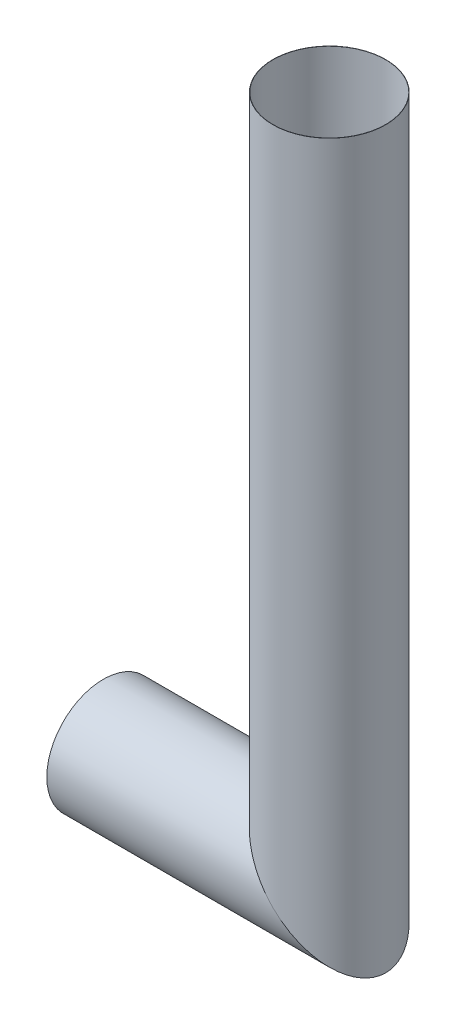
ISO-10303-21;
HEADER;
FILE_DESCRIPTION(('STEP AP214'),'2;1');
FILE_NAME('part.step','',(''),(''),'','','');
FILE_SCHEMA(('AUTOMOTIVE_DESIGN { 1 0 10303 214 1 1 1 1 }'));
ENDSEC;
DATA;
#1=APPLICATION_CONTEXT('core data for automotive mechanical design processes');
#2=APPLICATION_PROTOCOL_DEFINITION('international standard','automotive_design',2000,#1);
#3=PRODUCT_CONTEXT('',#1,'mechanical');
#4=PRODUCT('Part','Part','',(#3));
#5=PRODUCT_RELATED_PRODUCT_CATEGORY('part','',(#4));
#6=PRODUCT_DEFINITION_FORMATION('','',#4);
#7=PRODUCT_DEFINITION_CONTEXT('part definition',#1,'design');
#8=PRODUCT_DEFINITION('design','',#6,#7);
#9=PRODUCT_DEFINITION_SHAPE('','',#8);
#10=(LENGTH_UNIT() NAMED_UNIT(*) SI_UNIT(.MILLI.,.METRE.));
#11=(NAMED_UNIT(*) PLANE_ANGLE_UNIT() SI_UNIT($,.RADIAN.));
#12=(NAMED_UNIT(*) SI_UNIT($,.STERADIAN.) SOLID_ANGLE_UNIT());
#13=UNCERTAINTY_MEASURE_WITH_UNIT(LENGTH_MEASURE(1.E-05),#10,'distance_accuracy_value','');
#14=(GEOMETRIC_REPRESENTATION_CONTEXT(3) GLOBAL_UNCERTAINTY_ASSIGNED_CONTEXT((#13)) GLOBAL_UNIT_ASSIGNED_CONTEXT((#10,
#11,#12)) REPRESENTATION_CONTEXT('',''));
#15=CARTESIAN_POINT('',(0.,0.,0.));
#16=DIRECTION('',(0.,0.,1.));
#17=DIRECTION('',(1.,0.,0.));
#18=AXIS2_PLACEMENT_3D('',#15,#16,#17);
#19=CARTESIAN_POINT('',(0.,76.2,0.));
#20=DIRECTION('',(0.,1.,0.));
#21=DIRECTION('',(0.,0.,1.));
#22=AXIS2_PLACEMENT_3D('',#19,#20,#21);
#23=PLANE('',#22);
#24=CARTESIAN_POINT('',(0.,76.2,0.));
#25=DIRECTION('',(0.,1.,0.));
#26=DIRECTION('',(0.,0.,1.));
#27=AXIS2_PLACEMENT_3D('',#24,#25,#26);
#28=CIRCLE('',#27,6.3246);
#29=CARTESIAN_POINT('',(0.,76.2,6.3246));
#30=VERTEX_POINT('',#29);
#31=EDGE_CURVE('E48',#30,#30,#28,.T.);
#32=ORIENTED_EDGE('',*,*,#31,.F.);
#33=EDGE_LOOP('',(#32));
#34=FACE_BOUND('',#33,.T.);
#35=CARTESIAN_POINT('',(0.,76.2,0.));
#36=DIRECTION('',(0.,1.,0.));
#37=DIRECTION('',(0.,0.,1.));
#38=AXIS2_PLACEMENT_3D('',#35,#36,#37);
#39=CIRCLE('',#38,6.35);
#40=CARTESIAN_POINT('',(0.,76.2,6.35));
#41=VERTEX_POINT('',#40);
#42=EDGE_CURVE('E34',#41,#41,#39,.T.);
#43=ORIENTED_EDGE('',*,*,#42,.T.);
#44=EDGE_LOOP('',(#43));
#45=FACE_BOUND('',#44,.T.);
#46=ADVANCED_FACE('F31',(#34,#45),#23,.T.);
#47=CARTESIAN_POINT('',(-25.4,0.,0.));
#48=DIRECTION('',(1.,0.,0.));
#49=DIRECTION('',(0.,0.,1.));
#50=AXIS2_PLACEMENT_3D('',#47,#48,#49);
#51=PLANE('',#50);
#52=CARTESIAN_POINT('',(-25.4,0.,0.));
#53=DIRECTION('',(1.,0.,0.));
#54=DIRECTION('',(0.,1.,0.));
#55=AXIS2_PLACEMENT_3D('',#52,#53,#54);
#56=CIRCLE('',#55,6.3246);
#57=CARTESIAN_POINT('',(-25.4,6.3246,0.));
#58=VERTEX_POINT('',#57);
#59=EDGE_CURVE('E44',#58,#58,#56,.T.);
#60=ORIENTED_EDGE('',*,*,#59,.T.);
#61=EDGE_LOOP('',(#60));
#62=FACE_BOUND('',#61,.T.);
#63=CARTESIAN_POINT('',(-25.4,0.,0.));
#64=DIRECTION('',(1.,0.,0.));
#65=DIRECTION('',(0.,0.,1.));
#66=AXIS2_PLACEMENT_3D('',#63,#64,#65);
#67=CIRCLE('',#66,6.35);
#68=CARTESIAN_POINT('',(-25.4,0.,6.35));
#69=VERTEX_POINT('',#68);
#70=EDGE_CURVE('E38',#69,#69,#67,.T.);
#71=ORIENTED_EDGE('',*,*,#70,.F.);
#72=EDGE_LOOP('',(#71));
#73=FACE_BOUND('',#72,.T.);
#74=ADVANCED_FACE('F61',(#62,#73),#51,.F.);
#75=CARTESIAN_POINT('',(0.,-14.07,0.));
#76=DIRECTION('',(0.,1.,0.));
#77=DIRECTION('',(0.,0.,1.));
#78=AXIS2_PLACEMENT_3D('',#75,#76,#77);
#79=CYLINDRICAL_SURFACE('',#78,6.35);
#80=CARTESIAN_POINT('',(0.,0.,0.));
#81=DIRECTION('',(0.707106781186548,0.707106781186548,0.));
#82=DIRECTION('',(0.707106781186548,-0.707106781186548,0.));
#83=AXIS2_PLACEMENT_3D('',#80,#81,#82);
#84=ELLIPSE('',#83,8.98025612106915,6.35);
#85=CARTESIAN_POINT('',(6.35,-6.35,0.));
#86=VERTEX_POINT('',#85);
#87=EDGE_CURVE('E10',#86,#86,#84,.F.);
#88=ORIENTED_EDGE('',*,*,#87,.F.);
#89=EDGE_LOOP('',(#88));
#90=FACE_BOUND('',#89,.T.);
#91=ORIENTED_EDGE('',*,*,#42,.F.);
#92=EDGE_LOOP('',(#91));
#93=FACE_BOUND('',#92,.T.);
#94=ADVANCED_FACE('F58',(#90,#93),#79,.T.);
#95=CARTESIAN_POINT('',(-25.4,0.,0.));
#96=DIRECTION('',(1.,0.,0.));
#97=DIRECTION('',(0.,0.,-1.));
#98=AXIS2_PLACEMENT_3D('',#95,#96,#97);
#99=CYLINDRICAL_SURFACE('',#98,6.35);
#100=ORIENTED_EDGE('',*,*,#70,.T.);
#101=EDGE_LOOP('',(#100));
#102=FACE_BOUND('',#101,.T.);
#103=ORIENTED_EDGE('',*,*,#87,.T.);
#104=EDGE_LOOP('',(#103));
#105=FACE_BOUND('',#104,.T.);
#106=ADVANCED_FACE('F60',(#102,#105),#99,.T.);
#107=CARTESIAN_POINT('',(0.,-14.07,0.));
#108=DIRECTION('',(0.,1.,0.));
#109=DIRECTION('',(0.,0.,1.));
#110=AXIS2_PLACEMENT_3D('',#107,#108,#109);
#111=CYLINDRICAL_SURFACE('',#110,6.3246);
#112=CARTESIAN_POINT('',(0.,0.,0.));
#113=DIRECTION('',(0.707106781186547,0.707106781186547,0.));
#114=DIRECTION('',(-0.707106781186547,0.707106781186547,0.));
#115=AXIS2_PLACEMENT_3D('',#112,#113,#114);
#116=ELLIPSE('',#115,8.94433509658488,6.3246);
#117=CARTESIAN_POINT('',(-6.3246,6.3246,0.));
#118=VERTEX_POINT('',#117);
#119=EDGE_CURVE('E47',#118,#118,#116,.F.);
#120=ORIENTED_EDGE('',*,*,#119,.T.);
#121=EDGE_LOOP('',(#120));
#122=FACE_BOUND('',#121,.T.);
#123=ORIENTED_EDGE('',*,*,#31,.T.);
#124=EDGE_LOOP('',(#123));
#125=FACE_BOUND('',#124,.T.);
#126=ADVANCED_FACE('F68',(#122,#125),#111,.F.);
#127=CARTESIAN_POINT('',(-25.4,0.,0.));
#128=DIRECTION('',(1.,0.,0.));
#129=DIRECTION('',(0.,0.,-1.));
#130=AXIS2_PLACEMENT_3D('',#127,#128,#129);
#131=CYLINDRICAL_SURFACE('',#130,6.3246);
#132=ORIENTED_EDGE('',*,*,#59,.F.);
#133=EDGE_LOOP('',(#132));
#134=FACE_BOUND('',#133,.T.);
#135=ORIENTED_EDGE('',*,*,#119,.F.);
#136=EDGE_LOOP('',(#135));
#137=FACE_BOUND('',#136,.T.);
#138=ADVANCED_FACE('F73',(#134,#137),#131,.F.);
#139=CLOSED_SHELL('',(#46,#74,#94,#106,#126,#138));
#140=MANIFOLD_SOLID_BREP('B2',#139);
#141=ADVANCED_BREP_SHAPE_REPRESENTATION('',(#18,#140),#14);
#142=SHAPE_DEFINITION_REPRESENTATION(#9,#141);
ENDSEC;
END-ISO-10303-21;
